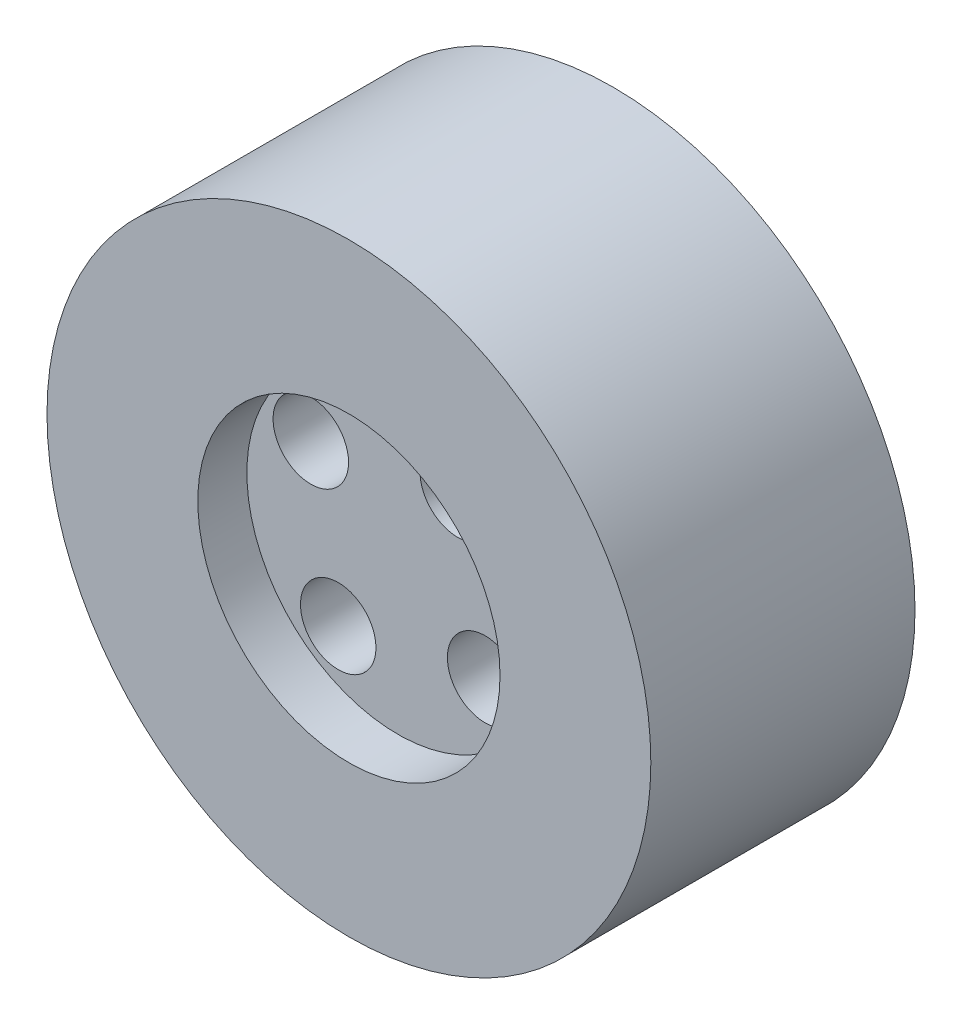
ISO-10303-21;
HEADER;
FILE_DESCRIPTION(('STEP AP214'),'2;1');
FILE_NAME('part.step','',(''),(''),'','','');
FILE_SCHEMA(('AUTOMOTIVE_DESIGN { 1 0 10303 214 1 1 1 1 }'));
ENDSEC;
DATA;
#1=APPLICATION_CONTEXT('core data for automotive mechanical design processes');
#2=APPLICATION_PROTOCOL_DEFINITION('international standard','automotive_design',2000,#1);
#3=PRODUCT_CONTEXT('',#1,'mechanical');
#4=PRODUCT('Part','Part','',(#3));
#5=PRODUCT_RELATED_PRODUCT_CATEGORY('part','',(#4));
#6=PRODUCT_DEFINITION_FORMATION('','',#4);
#7=PRODUCT_DEFINITION_CONTEXT('part definition',#1,'design');
#8=PRODUCT_DEFINITION('design','',#6,#7);
#9=PRODUCT_DEFINITION_SHAPE('','',#8);
#10=(LENGTH_UNIT() NAMED_UNIT(*) SI_UNIT(.MILLI.,.METRE.));
#11=(NAMED_UNIT(*) PLANE_ANGLE_UNIT() SI_UNIT($,.RADIAN.));
#12=(NAMED_UNIT(*) SI_UNIT($,.STERADIAN.) SOLID_ANGLE_UNIT());
#13=UNCERTAINTY_MEASURE_WITH_UNIT(LENGTH_MEASURE(1.E-05),#10,'distance_accuracy_value','');
#14=(GEOMETRIC_REPRESENTATION_CONTEXT(3) GLOBAL_UNCERTAINTY_ASSIGNED_CONTEXT((#13)) GLOBAL_UNIT_ASSIGNED_CONTEXT((#10,
#11,#12)) REPRESENTATION_CONTEXT('',''));
#15=CARTESIAN_POINT('',(0.,0.,0.));
#16=DIRECTION('',(0.,0.,1.));
#17=DIRECTION('',(1.,0.,0.));
#18=AXIS2_PLACEMENT_3D('',#15,#16,#17);
#19=CARTESIAN_POINT('',(0.,0.,35.));
#20=DIRECTION('',(0.,0.,-1.));
#21=DIRECTION('',(-1.,0.,0.));
#22=AXIS2_PLACEMENT_3D('',#19,#20,#21);
#23=CYLINDRICAL_SURFACE('',#22,40.);
#24=CARTESIAN_POINT('',(0.,0.,35.));
#25=DIRECTION('',(0.,0.,1.));
#26=DIRECTION('',(1.,0.,0.));
#27=AXIS2_PLACEMENT_3D('',#24,#25,#26);
#28=CIRCLE('',#27,40.);
#29=CARTESIAN_POINT('',(40.,0.,35.));
#30=VERTEX_POINT('',#29);
#31=EDGE_CURVE('E10',#30,#30,#28,.T.);
#32=ORIENTED_EDGE('',*,*,#31,.F.);
#33=EDGE_LOOP('',(#32));
#34=FACE_BOUND('',#33,.T.);
#35=CARTESIAN_POINT('',(0.,0.,0.));
#36=DIRECTION('',(0.,0.,1.));
#37=DIRECTION('',(1.,0.,0.));
#38=AXIS2_PLACEMENT_3D('',#35,#36,#37);
#39=CIRCLE('',#38,40.);
#40=CARTESIAN_POINT('',(40.,0.,0.));
#41=VERTEX_POINT('',#40);
#42=EDGE_CURVE('E51',#41,#41,#39,.T.);
#43=ORIENTED_EDGE('',*,*,#42,.T.);
#44=EDGE_LOOP('',(#43));
#45=FACE_BOUND('',#44,.T.);
#46=ADVANCED_FACE('F43',(#34,#45),#23,.T.);
#47=CARTESIAN_POINT('',(0.,0.,35.));
#48=DIRECTION('',(0.,0.,1.));
#49=DIRECTION('',(1.,0.,0.));
#50=AXIS2_PLACEMENT_3D('',#47,#48,#49);
#51=PLANE('',#50);
#52=CARTESIAN_POINT('',(0.,0.,35.));
#53=DIRECTION('',(0.,0.,1.));
#54=DIRECTION('',(1.,0.,0.));
#55=AXIS2_PLACEMENT_3D('',#52,#53,#54);
#56=CIRCLE('',#55,20.02);
#57=CARTESIAN_POINT('',(20.02,0.,35.));
#58=VERTEX_POINT('',#57);
#59=EDGE_CURVE('E60',#58,#58,#56,.T.);
#60=ORIENTED_EDGE('',*,*,#59,.F.);
#61=EDGE_LOOP('',(#60));
#62=FACE_BOUND('',#61,.T.);
#63=ORIENTED_EDGE('',*,*,#31,.T.);
#64=EDGE_LOOP('',(#63));
#65=FACE_BOUND('',#64,.T.);
#66=ADVANCED_FACE('F99',(#62,#65),#51,.T.);
#67=CARTESIAN_POINT('',(0.,0.,0.));
#68=DIRECTION('',(0.,0.,1.));
#69=DIRECTION('',(1.,0.,0.));
#70=AXIS2_PLACEMENT_3D('',#67,#68,#69);
#71=PLANE('',#70);
#72=CARTESIAN_POINT('',(-7.91791159830751,-11.5458510262946,0.));
#73=DIRECTION('',(0.,0.,1.));
#74=DIRECTION('',(0.,1.,0.));
#75=AXIS2_PLACEMENT_3D('',#72,#73,#74);
#76=CIRCLE('',#75,5.);
#77=CARTESIAN_POINT('',(-7.91791159830753,-6.54585102629457,0.));
#78=VERTEX_POINT('',#77);
#79=EDGE_CURVE('E72',#78,#78,#76,.T.);
#80=ORIENTED_EDGE('',*,*,#79,.T.);
#81=EDGE_LOOP('',(#80));
#82=FACE_BOUND('',#81,.T.);
#83=CARTESIAN_POINT('',(11.5458510262945,-7.91791159830755,0.));
#84=DIRECTION('',(0.,0.,1.));
#85=DIRECTION('',(-1.,0.,0.));
#86=AXIS2_PLACEMENT_3D('',#83,#84,#85);
#87=CIRCLE('',#86,5.);
#88=CARTESIAN_POINT('',(6.54585102629454,-7.91791159830755,0.));
#89=VERTEX_POINT('',#88);
#90=EDGE_CURVE('E136',#89,#89,#87,.T.);
#91=ORIENTED_EDGE('',*,*,#90,.T.);
#92=EDGE_LOOP('',(#91));
#93=FACE_BOUND('',#92,.T.);
#94=CARTESIAN_POINT('',(7.91791159830743,11.5458510262946,0.));
#95=DIRECTION('',(0.,0.,1.));
#96=DIRECTION('',(0.,-1.,0.));
#97=AXIS2_PLACEMENT_3D('',#94,#95,#96);
#98=CIRCLE('',#97,5.);
#99=CARTESIAN_POINT('',(7.91791159830748,6.54585102629462,0.));
#100=VERTEX_POINT('',#99);
#101=EDGE_CURVE('E87',#100,#100,#98,.T.);
#102=ORIENTED_EDGE('',*,*,#101,.T.);
#103=EDGE_LOOP('',(#102));
#104=FACE_BOUND('',#103,.T.);
#105=CARTESIAN_POINT('',(-11.5458510262945,7.91791159830755,0.));
#106=DIRECTION('',(0.,0.,1.));
#107=DIRECTION('',(1.,0.,0.));
#108=AXIS2_PLACEMENT_3D('',#105,#106,#107);
#109=CIRCLE('',#108,5.);
#110=CARTESIAN_POINT('',(-6.54585102629454,7.91791159830755,0.));
#111=VERTEX_POINT('',#110);
#112=EDGE_CURVE('E67',#111,#111,#109,.T.);
#113=ORIENTED_EDGE('',*,*,#112,.T.);
#114=EDGE_LOOP('',(#113));
#115=FACE_BOUND('',#114,.T.);
#116=ORIENTED_EDGE('',*,*,#42,.F.);
#117=EDGE_LOOP('',(#116));
#118=FACE_BOUND('',#117,.T.);
#119=ADVANCED_FACE('F101',(#82,#93,#104,#115,#118),#71,.F.);
#120=CARTESIAN_POINT('',(0.,0.,28.5));
#121=DIRECTION('',(0.,0.,1.));
#122=DIRECTION('',(1.,0.,0.));
#123=AXIS2_PLACEMENT_3D('',#120,#121,#122);
#124=CYLINDRICAL_SURFACE('',#123,20.02);
#125=CARTESIAN_POINT('',(0.,0.,28.5));
#126=DIRECTION('',(0.,0.,1.));
#127=DIRECTION('',(1.,0.,0.));
#128=AXIS2_PLACEMENT_3D('',#125,#126,#127);
#129=CIRCLE('',#128,20.02);
#130=CARTESIAN_POINT('',(20.02,0.,28.5));
#131=VERTEX_POINT('',#130);
#132=EDGE_CURVE('E57',#131,#131,#129,.T.);
#133=CARTESIAN_POINT('',(20.02,0.,28.5));
#134=CARTESIAN_POINT('',(20.02,0.,28.5677083333333));
#135=CARTESIAN_POINT('',(20.02,0.,28.6354166666667));
#136=CARTESIAN_POINT('',(20.02,0.,28.7708333333333));
#137=CARTESIAN_POINT('',(20.02,0.,28.8385416666667));
#138=CARTESIAN_POINT('',(20.02,0.,28.9739583333333));
#139=CARTESIAN_POINT('',(20.02,0.,29.0416666666667));
#140=CARTESIAN_POINT('',(20.02,0.,29.1770833333333));
#141=CARTESIAN_POINT('',(20.02,0.,29.2447916666667));
#142=CARTESIAN_POINT('',(20.02,0.,29.3802083333333));
#143=CARTESIAN_POINT('',(20.02,0.,29.4479166666667));
#144=CARTESIAN_POINT('',(20.02,0.,29.5833333333333));
#145=CARTESIAN_POINT('',(20.02,0.,29.6510416666667));
#146=CARTESIAN_POINT('',(20.02,0.,29.7864583333333));
#147=CARTESIAN_POINT('',(20.02,0.,29.8541666666667));
#148=CARTESIAN_POINT('',(20.02,0.,29.9895833333333));
#149=CARTESIAN_POINT('',(20.02,0.,30.0572916666667));
#150=CARTESIAN_POINT('',(20.02,0.,30.1927083333333));
#151=CARTESIAN_POINT('',(20.02,0.,30.2604166666667));
#152=CARTESIAN_POINT('',(20.02,0.,30.3958333333333));
#153=CARTESIAN_POINT('',(20.02,0.,30.4635416666667));
#154=CARTESIAN_POINT('',(20.02,0.,30.5989583333333));
#155=CARTESIAN_POINT('',(20.02,0.,30.6666666666667));
#156=CARTESIAN_POINT('',(20.02,0.,30.8020833333333));
#157=CARTESIAN_POINT('',(20.02,0.,30.8697916666667));
#158=CARTESIAN_POINT('',(20.02,0.,31.0052083333333));
#159=CARTESIAN_POINT('',(20.02,0.,31.0729166666667));
#160=CARTESIAN_POINT('',(20.02,0.,31.2083333333333));
#161=CARTESIAN_POINT('',(20.02,0.,31.2760416666667));
#162=CARTESIAN_POINT('',(20.02,0.,31.4114583333333));
#163=CARTESIAN_POINT('',(20.02,0.,31.4791666666667));
#164=CARTESIAN_POINT('',(20.02,0.,31.6145833333333));
#165=CARTESIAN_POINT('',(20.02,0.,31.6822916666667));
#166=CARTESIAN_POINT('',(20.02,0.,31.8177083333333));
#167=CARTESIAN_POINT('',(20.02,0.,31.8854166666667));
#168=CARTESIAN_POINT('',(20.02,0.,32.0208333333333));
#169=CARTESIAN_POINT('',(20.02,0.,32.0885416666667));
#170=CARTESIAN_POINT('',(20.02,0.,32.2239583333333));
#171=CARTESIAN_POINT('',(20.02,0.,32.2916666666667));
#172=CARTESIAN_POINT('',(20.02,0.,32.4270833333333));
#173=CARTESIAN_POINT('',(20.02,0.,32.4947916666667));
#174=CARTESIAN_POINT('',(20.02,0.,32.6302083333333));
#175=CARTESIAN_POINT('',(20.02,0.,32.6979166666667));
#176=CARTESIAN_POINT('',(20.02,0.,32.8333333333333));
#177=CARTESIAN_POINT('',(20.02,0.,32.9010416666667));
#178=CARTESIAN_POINT('',(20.02,0.,33.0364583333333));
#179=CARTESIAN_POINT('',(20.02,0.,33.1041666666667));
#180=CARTESIAN_POINT('',(20.02,0.,33.2395833333333));
#181=CARTESIAN_POINT('',(20.02,0.,33.3072916666667));
#182=CARTESIAN_POINT('',(20.02,0.,33.4427083333333));
#183=CARTESIAN_POINT('',(20.02,0.,33.5104166666667));
#184=CARTESIAN_POINT('',(20.02,0.,33.6458333333333));
#185=CARTESIAN_POINT('',(20.02,0.,33.7135416666667));
#186=CARTESIAN_POINT('',(20.02,0.,33.8489583333333));
#187=CARTESIAN_POINT('',(20.02,0.,33.9166666666667));
#188=CARTESIAN_POINT('',(20.02,0.,34.0520833333333));
#189=CARTESIAN_POINT('',(20.02,0.,34.1197916666667));
#190=CARTESIAN_POINT('',(20.02,0.,34.2552083333333));
#191=CARTESIAN_POINT('',(20.02,0.,34.3229166666667));
#192=CARTESIAN_POINT('',(20.02,0.,34.4583333333333));
#193=CARTESIAN_POINT('',(20.02,0.,34.5260416666667));
#194=CARTESIAN_POINT('',(20.02,0.,34.6614583333333));
#195=CARTESIAN_POINT('',(20.02,0.,34.7291666666667));
#196=CARTESIAN_POINT('',(20.02,0.,34.8645833333333));
#197=CARTESIAN_POINT('',(20.02,0.,34.9322916666667));
#198=CARTESIAN_POINT('',(20.02,0.,35.));
#199=B_SPLINE_CURVE_WITH_KNOTS('',3,(#133,#134,#135,#136,#137,#138,#139,#140,#141,#142,#143,
#144,#145,#146,#147,#148,#149,#150,#151,#152,#153,#154,#155,#156,#157,#158,#159,#160,#161,#162,
#163,#164,#165,#166,#167,#168,#169,#170,#171,#172,#173,#174,#175,#176,#177,#178,#179,#180,#181,
#182,#183,#184,#185,#186,#187,#188,#189,#190,#191,#192,#193,#194,#195,#196,#197,#198),
.UNSPECIFIED.,.F.,.F.,(4,2,2,2,2,2,2,2,2,2,2,2,2,2,2,2,2,2,2,2,2,2,2,2,2,2,2,2,2,2,2,2,4),(0.,
0.203125000000002,0.40625,0.609375000000002,0.812500000000001,1.015625,1.21875,1.421875,1.625,
1.828125,2.03125,2.234375,2.4375,2.640625,2.84375,3.046875,3.25,3.453125,3.65625,3.859375,
4.0625,4.265625,4.46875,4.671875,4.875,5.078125,5.28125,5.484375,5.68749999999999,5.890625,
6.09375,6.296875,6.5),.UNSPECIFIED.);
#200=EDGE_CURVE('BSEAM97',#131,#58,#199,.T.);
#201=ORIENTED_EDGE('',*,*,#132,.F.);
#202=ORIENTED_EDGE('',*,*,#59,.T.);
#203=ORIENTED_EDGE('',*,*,#200,.T.);
#204=ORIENTED_EDGE('',*,*,#200,.F.);
#205=EDGE_LOOP('',(#201,#203,#202,#204));
#206=FACE_BOUND('',#205,.T.);
#207=ADVANCED_FACE('F97',(#206),#124,.F.);
#208=CARTESIAN_POINT('',(0.,0.,28.5));
#209=DIRECTION('',(0.,0.,1.));
#210=DIRECTION('',(1.,0.,0.));
#211=AXIS2_PLACEMENT_3D('',#208,#209,#210);
#212=PLANE('',#211);
#213=CARTESIAN_POINT('',(-7.91791159830751,-11.5458510262946,28.5));
#214=DIRECTION('',(0.,0.,1.));
#215=DIRECTION('',(1.,0.,0.));
#216=AXIS2_PLACEMENT_3D('',#213,#214,#215);
#217=CIRCLE('',#216,5.);
#218=CARTESIAN_POINT('',(-2.91791159830751,-11.5458510262946,28.5));
#219=VERTEX_POINT('',#218);
#220=EDGE_CURVE('E46',#219,#219,#217,.T.);
#221=ORIENTED_EDGE('',*,*,#220,.F.);
#222=EDGE_LOOP('',(#221));
#223=FACE_BOUND('',#222,.T.);
#224=CARTESIAN_POINT('',(11.5458510262945,-7.91791159830755,28.5));
#225=DIRECTION('',(0.,0.,1.));
#226=DIRECTION('',(1.,0.,0.));
#227=AXIS2_PLACEMENT_3D('',#224,#225,#226);
#228=CIRCLE('',#227,5.);
#229=CARTESIAN_POINT('',(16.5458510262945,-7.91791159830755,28.5));
#230=VERTEX_POINT('',#229);
#231=EDGE_CURVE('E71',#230,#230,#228,.T.);
#232=ORIENTED_EDGE('',*,*,#231,.F.);
#233=EDGE_LOOP('',(#232));
#234=FACE_BOUND('',#233,.T.);
#235=CARTESIAN_POINT('',(7.91791159830743,11.5458510262946,28.5));
#236=DIRECTION('',(0.,0.,1.));
#237=DIRECTION('',(1.,0.,0.));
#238=AXIS2_PLACEMENT_3D('',#235,#236,#237);
#239=CIRCLE('',#238,5.);
#240=CARTESIAN_POINT('',(12.9179115983074,11.5458510262946,28.5));
#241=VERTEX_POINT('',#240);
#242=EDGE_CURVE('E68',#241,#241,#239,.T.);
#243=ORIENTED_EDGE('',*,*,#242,.F.);
#244=EDGE_LOOP('',(#243));
#245=FACE_BOUND('',#244,.T.);
#246=CARTESIAN_POINT('',(-11.5458510262945,7.91791159830755,28.5));
#247=DIRECTION('',(0.,0.,1.));
#248=DIRECTION('',(1.,0.,0.));
#249=AXIS2_PLACEMENT_3D('',#246,#247,#248);
#250=CIRCLE('',#249,5.);
#251=CARTESIAN_POINT('',(-6.54585102629454,7.91791159830755,28.5));
#252=VERTEX_POINT('',#251);
#253=EDGE_CURVE('E63',#252,#252,#250,.T.);
#254=ORIENTED_EDGE('',*,*,#253,.F.);
#255=EDGE_LOOP('',(#254));
#256=FACE_BOUND('',#255,.T.);
#257=ORIENTED_EDGE('',*,*,#132,.T.);
#258=EDGE_LOOP('',(#257));
#259=FACE_BOUND('',#258,.T.);
#260=ADVANCED_FACE('F112',(#223,#234,#245,#256,#259),#212,.T.);
#261=CARTESIAN_POINT('',(-11.5458510262945,7.91791159830755,0.));
#262=DIRECTION('',(0.,0.,1.));
#263=DIRECTION('',(1.,0.,0.));
#264=AXIS2_PLACEMENT_3D('',#261,#262,#263);
#265=CYLINDRICAL_SURFACE('',#264,5.);
#266=ORIENTED_EDGE('',*,*,#253,.T.);
#267=EDGE_LOOP('',(#266));
#268=FACE_BOUND('',#267,.T.);
#269=ORIENTED_EDGE('',*,*,#112,.F.);
#270=EDGE_LOOP('',(#269));
#271=FACE_BOUND('',#270,.T.);
#272=ADVANCED_FACE('F116',(#268,#271),#265,.F.);
#273=CARTESIAN_POINT('',(7.91791159830743,11.5458510262946,0.));
#274=DIRECTION('',(0.,0.,1.));
#275=DIRECTION('',(1.,0.,0.));
#276=AXIS2_PLACEMENT_3D('',#273,#274,#275);
#277=CYLINDRICAL_SURFACE('',#276,5.);
#278=ORIENTED_EDGE('',*,*,#242,.T.);
#279=EDGE_LOOP('',(#278));
#280=FACE_BOUND('',#279,.T.);
#281=ORIENTED_EDGE('',*,*,#101,.F.);
#282=EDGE_LOOP('',(#281));
#283=FACE_BOUND('',#282,.T.);
#284=ADVANCED_FACE('F120',(#280,#283),#277,.F.);
#285=CARTESIAN_POINT('',(11.5458510262945,-7.91791159830755,0.));
#286=DIRECTION('',(0.,0.,1.));
#287=DIRECTION('',(1.,0.,0.));
#288=AXIS2_PLACEMENT_3D('',#285,#286,#287);
#289=CYLINDRICAL_SURFACE('',#288,5.);
#290=ORIENTED_EDGE('',*,*,#231,.T.);
#291=EDGE_LOOP('',(#290));
#292=FACE_BOUND('',#291,.T.);
#293=ORIENTED_EDGE('',*,*,#90,.F.);
#294=EDGE_LOOP('',(#293));
#295=FACE_BOUND('',#294,.T.);
#296=ADVANCED_FACE('F124',(#292,#295),#289,.F.);
#297=CARTESIAN_POINT('',(-7.91791159830751,-11.5458510262946,0.));
#298=DIRECTION('',(0.,0.,1.));
#299=DIRECTION('',(1.,0.,0.));
#300=AXIS2_PLACEMENT_3D('',#297,#298,#299);
#301=CYLINDRICAL_SURFACE('',#300,5.);
#302=ORIENTED_EDGE('',*,*,#220,.T.);
#303=EDGE_LOOP('',(#302));
#304=FACE_BOUND('',#303,.T.);
#305=ORIENTED_EDGE('',*,*,#79,.F.);
#306=EDGE_LOOP('',(#305));
#307=FACE_BOUND('',#306,.T.);
#308=ADVANCED_FACE('F128',(#304,#307),#301,.F.);
#309=CLOSED_SHELL('',(#46,#66,#119,#207,#260,#272,#284,#296,#308));
#310=MANIFOLD_SOLID_BREP('B2',#309);
#311=ADVANCED_BREP_SHAPE_REPRESENTATION('',(#18,#310),#14);
#312=SHAPE_DEFINITION_REPRESENTATION(#9,#311);
ENDSEC;
END-ISO-10303-21;
